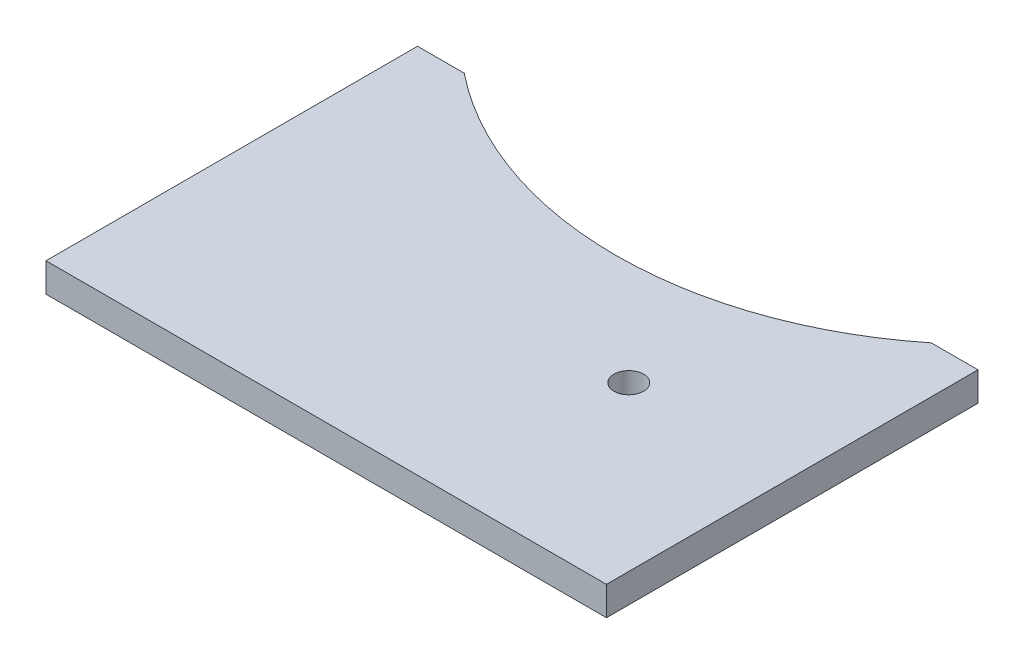
ISO-10303-21;
HEADER;
FILE_DESCRIPTION(('STEP AP214'),'2;1');
FILE_NAME('part.step','',(''),(''),'','','');
FILE_SCHEMA(('AUTOMOTIVE_DESIGN { 1 0 10303 214 1 1 1 1 }'));
ENDSEC;
DATA;
#1=APPLICATION_CONTEXT('core data for automotive mechanical design processes');
#2=APPLICATION_PROTOCOL_DEFINITION('international standard','automotive_design',2000,#1);
#3=PRODUCT_CONTEXT('',#1,'mechanical');
#4=PRODUCT('Part','Part','',(#3));
#5=PRODUCT_RELATED_PRODUCT_CATEGORY('part','',(#4));
#6=PRODUCT_DEFINITION_FORMATION('','',#4);
#7=PRODUCT_DEFINITION_CONTEXT('part definition',#1,'design');
#8=PRODUCT_DEFINITION('design','',#6,#7);
#9=PRODUCT_DEFINITION_SHAPE('','',#8);
#10=(LENGTH_UNIT() NAMED_UNIT(*) SI_UNIT(.MILLI.,.METRE.));
#11=(NAMED_UNIT(*) PLANE_ANGLE_UNIT() SI_UNIT($,.RADIAN.));
#12=(NAMED_UNIT(*) SI_UNIT($,.STERADIAN.) SOLID_ANGLE_UNIT());
#13=UNCERTAINTY_MEASURE_WITH_UNIT(LENGTH_MEASURE(1.E-05),#10,'distance_accuracy_value','');
#14=(GEOMETRIC_REPRESENTATION_CONTEXT(3) GLOBAL_UNCERTAINTY_ASSIGNED_CONTEXT((#13)) GLOBAL_UNIT_ASSIGNED_CONTEXT((#10,
#11,#12)) REPRESENTATION_CONTEXT('',''));
#15=CARTESIAN_POINT('',(0.,0.,0.));
#16=DIRECTION('',(0.,0.,1.));
#17=DIRECTION('',(1.,0.,0.));
#18=AXIS2_PLACEMENT_3D('',#15,#16,#17);
#19=CARTESIAN_POINT('',(0.,6.2,0.));
#20=DIRECTION('',(0.,0.,1.));
#21=DIRECTION('',(1.,0.,0.));
#22=AXIS2_PLACEMENT_3D('',#19,#20,#21);
#23=PLANE('',#22);
#24=DIRECTION('',(-1.,0.,0.));
#25=VECTOR('',#24,1.);
#26=CARTESIAN_POINT('',(0.,0.,0.));
#27=LINE('',#26,#25);
#28=CARTESIAN_POINT('',(9.99999999999999,0.,0.));
#29=VERTEX_POINT('',#28);
#30=CARTESIAN_POINT('',(0.,0.,0.));
#31=VERTEX_POINT('',#30);
#32=EDGE_CURVE('E120',#29,#31,#27,.T.);
#33=ORIENTED_EDGE('',*,*,#32,.T.);
#34=DIRECTION('',(0.,-1.,0.));
#35=VECTOR('',#34,1.);
#36=CARTESIAN_POINT('',(0.,6.2,0.));
#37=LINE('',#36,#35);
#38=CARTESIAN_POINT('',(0.,6.2,0.));
#39=VERTEX_POINT('',#38);
#40=EDGE_CURVE('E11',#39,#31,#37,.T.);
#41=ORIENTED_EDGE('',*,*,#40,.F.);
#42=DIRECTION('',(-1.,0.,0.));
#43=VECTOR('',#42,1.);
#44=CARTESIAN_POINT('',(0.,6.2,0.));
#45=LINE('',#44,#43);
#46=CARTESIAN_POINT('',(9.99999999999999,6.2,0.));
#47=VERTEX_POINT('',#46);
#48=EDGE_CURVE('E131',#47,#39,#45,.T.);
#49=ORIENTED_EDGE('',*,*,#48,.F.);
#50=DIRECTION('',(0.,-1.,0.));
#51=VECTOR('',#50,1.);
#52=CARTESIAN_POINT('',(9.99999999999999,6.2,0.));
#53=LINE('',#52,#51);
#54=EDGE_CURVE('E116',#47,#29,#53,.T.);
#55=ORIENTED_EDGE('',*,*,#54,.T.);
#56=EDGE_LOOP('',(#33,#41,#49,#55));
#57=FACE_BOUND('',#56,.T.);
#58=ADVANCED_FACE('F36',(#57),#23,.F.);
#59=CARTESIAN_POINT('',(0.,6.2,0.));
#60=DIRECTION('',(1.,0.,0.));
#61=DIRECTION('',(0.,0.,-1.));
#62=AXIS2_PLACEMENT_3D('',#59,#60,#61);
#63=PLANE('',#62);
#64=DIRECTION('',(0.,0.,1.));
#65=VECTOR('',#64,1.);
#66=CARTESIAN_POINT('',(0.,0.,0.));
#67=LINE('',#66,#65);
#68=CARTESIAN_POINT('',(0.,0.,79.550020016016));
#69=VERTEX_POINT('',#68);
#70=EDGE_CURVE('E123',#31,#69,#67,.T.);
#71=ORIENTED_EDGE('',*,*,#70,.T.);
#72=DIRECTION('',(0.,-1.,0.));
#73=VECTOR('',#72,1.);
#74=CARTESIAN_POINT('',(0.,6.2,79.550020016016));
#75=LINE('',#74,#73);
#76=CARTESIAN_POINT('',(0.,6.2,79.550020016016));
#77=VERTEX_POINT('',#76);
#78=EDGE_CURVE('E44',#77,#69,#75,.T.);
#79=ORIENTED_EDGE('',*,*,#78,.F.);
#80=DIRECTION('',(0.,0.,1.));
#81=VECTOR('',#80,1.);
#82=CARTESIAN_POINT('',(0.,6.2,0.));
#83=LINE('',#82,#81);
#84=EDGE_CURVE('E89',#39,#77,#83,.T.);
#85=ORIENTED_EDGE('',*,*,#84,.F.);
#86=ORIENTED_EDGE('',*,*,#40,.T.);
#87=EDGE_LOOP('',(#71,#79,#85,#86));
#88=FACE_BOUND('',#87,.T.);
#89=ADVANCED_FACE('F156',(#88),#63,.F.);
#90=CARTESIAN_POINT('',(0.,6.2,79.550020016016));
#91=DIRECTION('',(0.,0.,-1.));
#92=DIRECTION('',(-1.,0.,0.));
#93=AXIS2_PLACEMENT_3D('',#90,#91,#92);
#94=PLANE('',#93);
#95=DIRECTION('',(1.,0.,0.));
#96=VECTOR('',#95,1.);
#97=CARTESIAN_POINT('',(0.,0.,79.550020016016));
#98=LINE('',#97,#96);
#99=CARTESIAN_POINT('',(120.,0.,79.550020016016));
#100=VERTEX_POINT('',#99);
#101=EDGE_CURVE('E126',#69,#100,#98,.T.);
#102=ORIENTED_EDGE('',*,*,#101,.T.);
#103=DIRECTION('',(0.,-1.,0.));
#104=VECTOR('',#103,1.);
#105=CARTESIAN_POINT('',(120.,6.2,79.550020016016));
#106=LINE('',#105,#104);
#107=CARTESIAN_POINT('',(120.,6.2,79.550020016016));
#108=VERTEX_POINT('',#107);
#109=EDGE_CURVE('E111',#108,#100,#106,.T.);
#110=ORIENTED_EDGE('',*,*,#109,.F.);
#111=DIRECTION('',(1.,0.,0.));
#112=VECTOR('',#111,1.);
#113=CARTESIAN_POINT('',(0.,6.2,79.550020016016));
#114=LINE('',#113,#112);
#115=EDGE_CURVE('E102',#77,#108,#114,.T.);
#116=ORIENTED_EDGE('',*,*,#115,.F.);
#117=ORIENTED_EDGE('',*,*,#78,.T.);
#118=EDGE_LOOP('',(#102,#110,#116,#117));
#119=FACE_BOUND('',#118,.T.);
#120=ADVANCED_FACE('F137',(#119),#94,.F.);
#121=CARTESIAN_POINT('',(120.,6.2,79.550020016016));
#122=DIRECTION('',(-1.,0.,0.));
#123=DIRECTION('',(0.,0.,1.));
#124=AXIS2_PLACEMENT_3D('',#121,#122,#123);
#125=PLANE('',#124);
#126=DIRECTION('',(0.,0.,-1.));
#127=VECTOR('',#126,1.);
#128=CARTESIAN_POINT('',(120.,0.,79.550020016016));
#129=LINE('',#128,#127);
#130=CARTESIAN_POINT('',(120.,0.,0.));
#131=VERTEX_POINT('',#130);
#132=EDGE_CURVE('E110',#100,#131,#129,.T.);
#133=ORIENTED_EDGE('',*,*,#132,.T.);
#134=DIRECTION('',(0.,-1.,0.));
#135=VECTOR('',#134,1.);
#136=CARTESIAN_POINT('',(120.,6.2,0.));
#137=LINE('',#136,#135);
#138=CARTESIAN_POINT('',(120.,6.2,0.));
#139=VERTEX_POINT('',#138);
#140=EDGE_CURVE('E107',#139,#131,#137,.T.);
#141=ORIENTED_EDGE('',*,*,#140,.F.);
#142=DIRECTION('',(0.,0.,-1.));
#143=VECTOR('',#142,1.);
#144=CARTESIAN_POINT('',(120.,6.2,79.550020016016));
#145=LINE('',#144,#143);
#146=EDGE_CURVE('E96',#108,#139,#145,.T.);
#147=ORIENTED_EDGE('',*,*,#146,.F.);
#148=ORIENTED_EDGE('',*,*,#109,.T.);
#149=EDGE_LOOP('',(#133,#141,#147,#148));
#150=FACE_BOUND('',#149,.T.);
#151=ADVANCED_FACE('F108',(#150),#125,.F.);
#152=CARTESIAN_POINT('',(120.,6.2,0.));
#153=DIRECTION('',(0.,0.,1.));
#154=DIRECTION('',(1.,0.,0.));
#155=AXIS2_PLACEMENT_3D('',#152,#153,#154);
#156=PLANE('',#155);
#157=DIRECTION('',(-1.,0.,0.));
#158=VECTOR('',#157,1.);
#159=CARTESIAN_POINT('',(120.,0.,0.));
#160=LINE('',#159,#158);
#161=CARTESIAN_POINT('',(110.,0.,0.));
#162=VERTEX_POINT('',#161);
#163=EDGE_CURVE('E75',#131,#162,#160,.T.);
#164=ORIENTED_EDGE('',*,*,#163,.T.);
#165=DIRECTION('',(0.,-1.,0.));
#166=VECTOR('',#165,1.);
#167=CARTESIAN_POINT('',(110.,6.2,0.));
#168=LINE('',#167,#166);
#169=CARTESIAN_POINT('',(110.,6.2,0.));
#170=VERTEX_POINT('',#169);
#171=EDGE_CURVE('E112',#170,#162,#168,.T.);
#172=ORIENTED_EDGE('',*,*,#171,.F.);
#173=DIRECTION('',(-1.,0.,0.));
#174=VECTOR('',#173,1.);
#175=CARTESIAN_POINT('',(120.,6.2,0.));
#176=LINE('',#175,#174);
#177=EDGE_CURVE('E100',#139,#170,#176,.T.);
#178=ORIENTED_EDGE('',*,*,#177,.F.);
#179=ORIENTED_EDGE('',*,*,#140,.T.);
#180=EDGE_LOOP('',(#164,#172,#178,#179));
#181=FACE_BOUND('',#180,.T.);
#182=ADVANCED_FACE('F114',(#181),#156,.F.);
#183=CARTESIAN_POINT('',(60.,6.2,-62.449979983984));
#184=DIRECTION('',(0.,-1.,0.));
#185=DIRECTION('',(0.,0.,-1.));
#186=AXIS2_PLACEMENT_3D('',#183,#184,#185);
#187=CYLINDRICAL_SURFACE('',#186,80.);
#188=CARTESIAN_POINT('',(60.,0.,-62.449979983984));
#189=DIRECTION('',(0.,-1.,0.));
#190=DIRECTION('',(0.,0.,1.));
#191=AXIS2_PLACEMENT_3D('',#188,#189,#190);
#192=CIRCLE('',#191,80.);
#193=EDGE_CURVE('E81',#162,#29,#192,.T.);
#194=ORIENTED_EDGE('',*,*,#193,.T.);
#195=ORIENTED_EDGE('',*,*,#54,.F.);
#196=CARTESIAN_POINT('',(60.,6.2,-62.449979983984));
#197=DIRECTION('',(0.,-1.,0.));
#198=DIRECTION('',(0.,0.,1.));
#199=AXIS2_PLACEMENT_3D('',#196,#197,#198);
#200=CIRCLE('',#199,80.);
#201=EDGE_CURVE('E52',#170,#47,#200,.T.);
#202=ORIENTED_EDGE('',*,*,#201,.F.);
#203=ORIENTED_EDGE('',*,*,#171,.T.);
#204=EDGE_LOOP('',(#194,#195,#202,#203));
#205=FACE_BOUND('',#204,.T.);
#206=ADVANCED_FACE('F144',(#205),#187,.F.);
#207=CARTESIAN_POINT('',(60.,6.2,-62.449979983984));
#208=DIRECTION('',(0.,1.,0.));
#209=DIRECTION('',(0.,0.,1.));
#210=AXIS2_PLACEMENT_3D('',#207,#208,#209);
#211=PLANE('',#210);
#212=CARTESIAN_POINT('',(85.,6.2,39.775010008008));
#213=DIRECTION('',(0.,1.,0.));
#214=DIRECTION('',(0.,0.,1.));
#215=AXIS2_PLACEMENT_3D('',#212,#213,#214);
#216=CIRCLE('',#215,3.175);
#217=CARTESIAN_POINT('',(85.,6.2,42.950010008008));
#218=VERTEX_POINT('',#217);
#219=EDGE_CURVE('E211',#218,#218,#216,.T.);
#220=ORIENTED_EDGE('',*,*,#219,.F.);
#221=EDGE_LOOP('',(#220));
#222=FACE_BOUND('',#221,.T.);
#223=ORIENTED_EDGE('',*,*,#48,.T.);
#224=ORIENTED_EDGE('',*,*,#84,.T.);
#225=ORIENTED_EDGE('',*,*,#115,.T.);
#226=ORIENTED_EDGE('',*,*,#146,.T.);
#227=ORIENTED_EDGE('',*,*,#177,.T.);
#228=ORIENTED_EDGE('',*,*,#201,.T.);
#229=EDGE_LOOP('',(#223,#224,#225,#226,#227,#228));
#230=FACE_BOUND('',#229,.T.);
#231=ADVANCED_FACE('F98',(#222,#230),#211,.T.);
#232=CARTESIAN_POINT('',(60.,0.,-62.449979983984));
#233=DIRECTION('',(0.,1.,0.));
#234=DIRECTION('',(0.,0.,1.));
#235=AXIS2_PLACEMENT_3D('',#232,#233,#234);
#236=PLANE('',#235);
#237=CARTESIAN_POINT('',(85.,0.,39.775010008008));
#238=DIRECTION('',(0.,1.,0.));
#239=DIRECTION('',(0.,0.,1.));
#240=AXIS2_PLACEMENT_3D('',#237,#238,#239);
#241=CIRCLE('',#240,3.175);
#242=CARTESIAN_POINT('',(85.,0.,42.950010008008));
#243=VERTEX_POINT('',#242);
#244=EDGE_CURVE('E124',#243,#243,#241,.T.);
#245=ORIENTED_EDGE('',*,*,#244,.T.);
#246=EDGE_LOOP('',(#245));
#247=FACE_BOUND('',#246,.T.);
#248=ORIENTED_EDGE('',*,*,#32,.F.);
#249=ORIENTED_EDGE('',*,*,#193,.F.);
#250=ORIENTED_EDGE('',*,*,#163,.F.);
#251=ORIENTED_EDGE('',*,*,#132,.F.);
#252=ORIENTED_EDGE('',*,*,#101,.F.);
#253=ORIENTED_EDGE('',*,*,#70,.F.);
#254=EDGE_LOOP('',(#248,#249,#250,#251,#252,#253));
#255=FACE_BOUND('',#254,.T.);
#256=ADVANCED_FACE('F140',(#247,#255),#236,.F.);
#257=CARTESIAN_POINT('',(85.,0.,39.775010008008));
#258=DIRECTION('',(0.,1.,0.));
#259=DIRECTION('',(0.,0.,1.));
#260=AXIS2_PLACEMENT_3D('',#257,#258,#259);
#261=CYLINDRICAL_SURFACE('',#260,3.175);
#262=CARTESIAN_POINT('',(85.,0.,42.950010008008));
#263=CARTESIAN_POINT('',(85.,0.0645833333333333,42.950010008008));
#264=CARTESIAN_POINT('',(85.,0.129166666666667,42.950010008008));
#265=CARTESIAN_POINT('',(85.,0.258333333333333,42.950010008008));
#266=CARTESIAN_POINT('',(85.,0.322916666666667,42.950010008008));
#267=CARTESIAN_POINT('',(85.,0.452083333333333,42.950010008008));
#268=CARTESIAN_POINT('',(85.,0.516666666666667,42.950010008008));
#269=CARTESIAN_POINT('',(85.,0.645833333333333,42.950010008008));
#270=CARTESIAN_POINT('',(85.,0.710416666666667,42.950010008008));
#271=CARTESIAN_POINT('',(85.,0.839583333333333,42.950010008008));
#272=CARTESIAN_POINT('',(85.,0.904166666666667,42.950010008008));
#273=CARTESIAN_POINT('',(85.,1.03333333333333,42.950010008008));
#274=CARTESIAN_POINT('',(85.,1.09791666666667,42.950010008008));
#275=CARTESIAN_POINT('',(85.,1.22708333333333,42.950010008008));
#276=CARTESIAN_POINT('',(85.,1.29166666666667,42.950010008008));
#277=CARTESIAN_POINT('',(85.,1.42083333333333,42.950010008008));
#278=CARTESIAN_POINT('',(85.,1.48541666666667,42.950010008008));
#279=CARTESIAN_POINT('',(85.,1.61458333333333,42.950010008008));
#280=CARTESIAN_POINT('',(85.,1.67916666666667,42.950010008008));
#281=CARTESIAN_POINT('',(85.,1.80833333333333,42.950010008008));
#282=CARTESIAN_POINT('',(85.,1.87291666666667,42.950010008008));
#283=CARTESIAN_POINT('',(85.,2.00208333333333,42.950010008008));
#284=CARTESIAN_POINT('',(85.,2.06666666666667,42.950010008008));
#285=CARTESIAN_POINT('',(85.,2.19583333333333,42.950010008008));
#286=CARTESIAN_POINT('',(85.,2.26041666666667,42.950010008008));
#287=CARTESIAN_POINT('',(85.,2.38958333333333,42.950010008008));
#288=CARTESIAN_POINT('',(85.,2.45416666666667,42.950010008008));
#289=CARTESIAN_POINT('',(85.,2.58333333333333,42.950010008008));
#290=CARTESIAN_POINT('',(85.,2.64791666666667,42.950010008008));
#291=CARTESIAN_POINT('',(85.,2.77708333333333,42.950010008008));
#292=CARTESIAN_POINT('',(85.,2.84166666666667,42.950010008008));
#293=CARTESIAN_POINT('',(85.,2.97083333333333,42.950010008008));
#294=CARTESIAN_POINT('',(85.,3.03541666666667,42.950010008008));
#295=CARTESIAN_POINT('',(85.,3.16458333333333,42.950010008008));
#296=CARTESIAN_POINT('',(85.,3.22916666666667,42.950010008008));
#297=CARTESIAN_POINT('',(85.,3.35833333333333,42.950010008008));
#298=CARTESIAN_POINT('',(85.,3.42291666666667,42.950010008008));
#299=CARTESIAN_POINT('',(85.,3.55208333333333,42.950010008008));
#300=CARTESIAN_POINT('',(85.,3.61666666666667,42.950010008008));
#301=CARTESIAN_POINT('',(85.,3.74583333333333,42.950010008008));
#302=CARTESIAN_POINT('',(85.,3.81041666666667,42.950010008008));
#303=CARTESIAN_POINT('',(85.,3.93958333333333,42.950010008008));
#304=CARTESIAN_POINT('',(85.,4.00416666666667,42.950010008008));
#305=CARTESIAN_POINT('',(85.,4.13333333333333,42.950010008008));
#306=CARTESIAN_POINT('',(85.,4.19791666666667,42.950010008008));
#307=CARTESIAN_POINT('',(85.,4.32708333333333,42.950010008008));
#308=CARTESIAN_POINT('',(85.,4.39166666666667,42.950010008008));
#309=CARTESIAN_POINT('',(85.,4.52083333333333,42.950010008008));
#310=CARTESIAN_POINT('',(85.,4.58541666666667,42.950010008008));
#311=CARTESIAN_POINT('',(85.,4.71458333333333,42.950010008008));
#312=CARTESIAN_POINT('',(85.,4.77916666666667,42.950010008008));
#313=CARTESIAN_POINT('',(85.,4.90833333333333,42.950010008008));
#314=CARTESIAN_POINT('',(85.,4.97291666666667,42.950010008008));
#315=CARTESIAN_POINT('',(85.,5.10208333333333,42.950010008008));
#316=CARTESIAN_POINT('',(85.,5.16666666666667,42.950010008008));
#317=CARTESIAN_POINT('',(85.,5.29583333333333,42.950010008008));
#318=CARTESIAN_POINT('',(85.,5.36041666666667,42.950010008008));
#319=CARTESIAN_POINT('',(85.,5.48958333333333,42.950010008008));
#320=CARTESIAN_POINT('',(85.,5.55416666666667,42.950010008008));
#321=CARTESIAN_POINT('',(85.,5.68333333333333,42.950010008008));
#322=CARTESIAN_POINT('',(85.,5.74791666666667,42.950010008008));
#323=CARTESIAN_POINT('',(85.,5.87708333333333,42.950010008008));
#324=CARTESIAN_POINT('',(85.,5.94166666666667,42.950010008008));
#325=CARTESIAN_POINT('',(85.,6.07083333333333,42.950010008008));
#326=CARTESIAN_POINT('',(85.,6.13541666666667,42.950010008008));
#327=CARTESIAN_POINT('',(85.,6.2,42.950010008008));
#328=B_SPLINE_CURVE_WITH_KNOTS('',3,(#262,#263,#264,#265,#266,#267,#268,#269,#270,#271,#272,
#273,#274,#275,#276,#277,#278,#279,#280,#281,#282,#283,#284,#285,#286,#287,#288,#289,#290,#291,
#292,#293,#294,#295,#296,#297,#298,#299,#300,#301,#302,#303,#304,#305,#306,#307,#308,#309,#310,
#311,#312,#313,#314,#315,#316,#317,#318,#319,#320,#321,#322,#323,#324,#325,#326,#327),
.UNSPECIFIED.,.F.,.F.,(4,2,2,2,2,2,2,2,2,2,2,2,2,2,2,2,2,2,2,2,2,2,2,2,2,2,2,2,2,2,2,2,4),(0.,
0.19375,0.3875,0.58125,0.775,0.96875,1.1625,1.35625,1.55,1.74375,1.9375,2.13125,2.325,2.51875,
2.7125,2.90625,3.1,3.29375,3.4875,3.68125,3.875,4.06875,4.2625,4.45625,4.65,4.84375,5.0375,
5.23125,5.425,5.61875,5.8125,6.00625,6.2),.UNSPECIFIED.);
#329=EDGE_CURVE('BSEAM193',#243,#218,#328,.T.);
#330=ORIENTED_EDGE('',*,*,#244,.F.);
#331=ORIENTED_EDGE('',*,*,#219,.T.);
#332=ORIENTED_EDGE('',*,*,#329,.T.);
#333=ORIENTED_EDGE('',*,*,#329,.F.);
#334=EDGE_LOOP('',(#330,#332,#331,#333));
#335=FACE_BOUND('',#334,.T.);
#336=ADVANCED_FACE('F193',(#335),#261,.F.);
#337=CLOSED_SHELL('',(#58,#89,#120,#151,#182,#206,#231,#256,#336));
#338=MANIFOLD_SOLID_BREP('B2',#337);
#339=ADVANCED_BREP_SHAPE_REPRESENTATION('',(#18,#338),#14);
#340=SHAPE_DEFINITION_REPRESENTATION(#9,#339);
ENDSEC;
END-ISO-10303-21;
